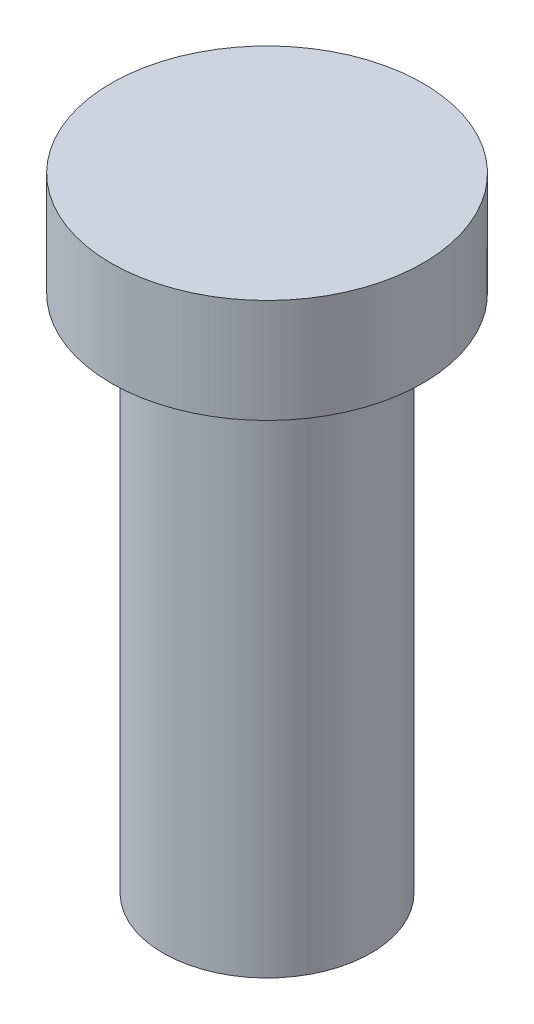
ISO-10303-21;
HEADER;
FILE_DESCRIPTION(('STEP AP214'),'2;1');
FILE_NAME('part.step','',(''),(''),'','','');
FILE_SCHEMA(('AUTOMOTIVE_DESIGN { 1 0 10303 214 1 1 1 1 }'));
ENDSEC;
DATA;
#1=APPLICATION_CONTEXT('core data for automotive mechanical design processes');
#2=APPLICATION_PROTOCOL_DEFINITION('international standard','automotive_design',2000,#1);
#3=PRODUCT_CONTEXT('',#1,'mechanical');
#4=PRODUCT('Part','Part','',(#3));
#5=PRODUCT_RELATED_PRODUCT_CATEGORY('part','',(#4));
#6=PRODUCT_DEFINITION_FORMATION('','',#4);
#7=PRODUCT_DEFINITION_CONTEXT('part definition',#1,'design');
#8=PRODUCT_DEFINITION('design','',#6,#7);
#9=PRODUCT_DEFINITION_SHAPE('','',#8);
#10=(LENGTH_UNIT() NAMED_UNIT(*) SI_UNIT(.MILLI.,.METRE.));
#11=(NAMED_UNIT(*) PLANE_ANGLE_UNIT() SI_UNIT($,.RADIAN.));
#12=(NAMED_UNIT(*) SI_UNIT($,.STERADIAN.) SOLID_ANGLE_UNIT());
#13=UNCERTAINTY_MEASURE_WITH_UNIT(LENGTH_MEASURE(1.E-05),#10,'distance_accuracy_value','');
#14=(GEOMETRIC_REPRESENTATION_CONTEXT(3) GLOBAL_UNCERTAINTY_ASSIGNED_CONTEXT((#13)) GLOBAL_UNIT_ASSIGNED_CONTEXT((#10,
#11,#12)) REPRESENTATION_CONTEXT('',''));
#15=CARTESIAN_POINT('',(0.,0.,0.));
#16=DIRECTION('',(0.,0.,1.));
#17=DIRECTION('',(1.,0.,0.));
#18=AXIS2_PLACEMENT_3D('',#15,#16,#17);
#19=CARTESIAN_POINT('',(0.,10.,0.));
#20=DIRECTION('',(0.,-1.,0.));
#21=DIRECTION('',(0.,0.,-1.));
#22=AXIS2_PLACEMENT_3D('',#19,#20,#21);
#23=CYLINDRICAL_SURFACE('',#22,2.);
#24=CARTESIAN_POINT('',(0.,10.,0.));
#25=DIRECTION('',(0.,1.,0.));
#26=DIRECTION('',(0.,0.,1.));
#27=AXIS2_PLACEMENT_3D('',#24,#25,#26);
#28=CIRCLE('',#27,2.);
#29=CARTESIAN_POINT('',(0.,10.,2.));
#30=VERTEX_POINT('',#29);
#31=EDGE_CURVE('E10',#30,#30,#28,.T.);
#32=ORIENTED_EDGE('',*,*,#31,.F.);
#33=EDGE_LOOP('',(#32));
#34=FACE_BOUND('',#33,.T.);
#35=CARTESIAN_POINT('',(0.,0.,0.));
#36=DIRECTION('',(0.,1.,0.));
#37=DIRECTION('',(0.,0.,1.));
#38=AXIS2_PLACEMENT_3D('',#35,#36,#37);
#39=CIRCLE('',#38,2.);
#40=CARTESIAN_POINT('',(0.,0.,2.));
#41=VERTEX_POINT('',#40);
#42=EDGE_CURVE('E32',#41,#41,#39,.T.);
#43=ORIENTED_EDGE('',*,*,#42,.T.);
#44=EDGE_LOOP('',(#43));
#45=FACE_BOUND('',#44,.T.);
#46=ADVANCED_FACE('F29',(#34,#45),#23,.T.);
#47=CARTESIAN_POINT('',(0.,0.,0.));
#48=DIRECTION('',(0.,1.,0.));
#49=DIRECTION('',(0.,0.,1.));
#50=AXIS2_PLACEMENT_3D('',#47,#48,#49);
#51=PLANE('',#50);
#52=ORIENTED_EDGE('',*,*,#42,.F.);
#53=EDGE_LOOP('',(#52));
#54=FACE_BOUND('',#53,.T.);
#55=ADVANCED_FACE('F57',(#54),#51,.F.);
#56=CARTESIAN_POINT('',(0.,10.,0.));
#57=DIRECTION('',(0.,1.,0.));
#58=DIRECTION('',(0.,0.,1.));
#59=AXIS2_PLACEMENT_3D('',#56,#57,#58);
#60=PLANE('',#59);
#61=CARTESIAN_POINT('',(0.,10.,0.));
#62=DIRECTION('',(0.,1.,0.));
#63=DIRECTION('',(0.,0.,1.));
#64=AXIS2_PLACEMENT_3D('',#61,#62,#63);
#65=CIRCLE('',#64,3.);
#66=CARTESIAN_POINT('',(0.,10.,3.));
#67=VERTEX_POINT('',#66);
#68=EDGE_CURVE('E41',#67,#67,#65,.T.);
#69=ORIENTED_EDGE('',*,*,#68,.F.);
#70=EDGE_LOOP('',(#69));
#71=FACE_BOUND('',#70,.T.);
#72=ORIENTED_EDGE('',*,*,#31,.T.);
#73=EDGE_LOOP('',(#72));
#74=FACE_BOUND('',#73,.T.);
#75=ADVANCED_FACE('F52',(#71,#74),#60,.F.);
#76=CARTESIAN_POINT('',(0.,12.,0.));
#77=DIRECTION('',(0.,-1.,0.));
#78=DIRECTION('',(0.,0.,-1.));
#79=AXIS2_PLACEMENT_3D('',#76,#77,#78);
#80=CYLINDRICAL_SURFACE('',#79,3.);
#81=CARTESIAN_POINT('',(0.,12.,0.));
#82=DIRECTION('',(0.,1.,0.));
#83=DIRECTION('',(0.,0.,1.));
#84=AXIS2_PLACEMENT_3D('',#81,#82,#83);
#85=CIRCLE('',#84,3.);
#86=CARTESIAN_POINT('',(0.,12.,3.));
#87=VERTEX_POINT('',#86);
#88=EDGE_CURVE('E39',#87,#87,#85,.T.);
#89=ORIENTED_EDGE('',*,*,#88,.F.);
#90=EDGE_LOOP('',(#89));
#91=FACE_BOUND('',#90,.T.);
#92=ORIENTED_EDGE('',*,*,#68,.T.);
#93=EDGE_LOOP('',(#92));
#94=FACE_BOUND('',#93,.T.);
#95=ADVANCED_FACE('F49',(#91,#94),#80,.T.);
#96=CARTESIAN_POINT('',(0.,12.,0.));
#97=DIRECTION('',(0.,1.,0.));
#98=DIRECTION('',(0.,0.,1.));
#99=AXIS2_PLACEMENT_3D('',#96,#97,#98);
#100=PLANE('',#99);
#101=ORIENTED_EDGE('',*,*,#88,.T.);
#102=EDGE_LOOP('',(#101));
#103=FACE_BOUND('',#102,.T.);
#104=ADVANCED_FACE('F47',(#103),#100,.T.);
#105=CLOSED_SHELL('',(#46,#55,#75,#95,#104));
#106=MANIFOLD_SOLID_BREP('B2',#105);
#107=ADVANCED_BREP_SHAPE_REPRESENTATION('',(#18,#106),#14);
#108=SHAPE_DEFINITION_REPRESENTATION(#9,#107);
ENDSEC;
END-ISO-10303-21;
